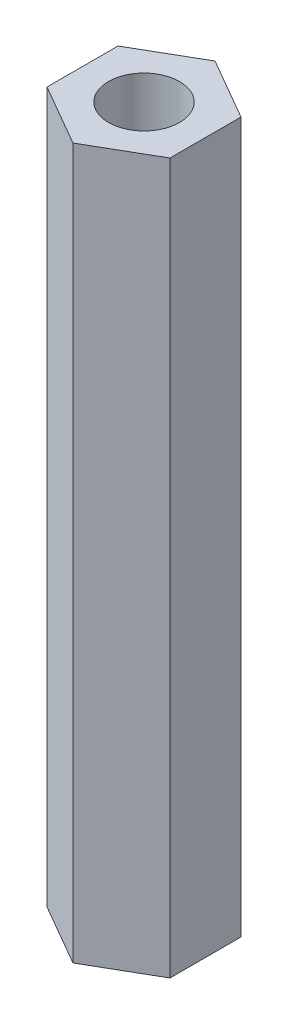
ISO-10303-21;
HEADER;
FILE_DESCRIPTION(('STEP AP214'),'2;1');
FILE_NAME('part.step','',(''),(''),'','','');
FILE_SCHEMA(('AUTOMOTIVE_DESIGN { 1 0 10303 214 1 1 1 1 }'));
ENDSEC;
DATA;
#1=APPLICATION_CONTEXT('core data for automotive mechanical design processes');
#2=APPLICATION_PROTOCOL_DEFINITION('international standard','automotive_design',2000,#1);
#3=PRODUCT_CONTEXT('',#1,'mechanical');
#4=PRODUCT('Part','Part','',(#3));
#5=PRODUCT_RELATED_PRODUCT_CATEGORY('part','',(#4));
#6=PRODUCT_DEFINITION_FORMATION('','',#4);
#7=PRODUCT_DEFINITION_CONTEXT('part definition',#1,'design');
#8=PRODUCT_DEFINITION('design','',#6,#7);
#9=PRODUCT_DEFINITION_SHAPE('','',#8);
#10=(LENGTH_UNIT() NAMED_UNIT(*) SI_UNIT(.MILLI.,.METRE.));
#11=(NAMED_UNIT(*) PLANE_ANGLE_UNIT() SI_UNIT($,.RADIAN.));
#12=(NAMED_UNIT(*) SI_UNIT($,.STERADIAN.) SOLID_ANGLE_UNIT());
#13=UNCERTAINTY_MEASURE_WITH_UNIT(LENGTH_MEASURE(1.E-05),#10,'distance_accuracy_value','');
#14=(GEOMETRIC_REPRESENTATION_CONTEXT(3) GLOBAL_UNCERTAINTY_ASSIGNED_CONTEXT((#13)) GLOBAL_UNIT_ASSIGNED_CONTEXT((#10,
#11,#12)) REPRESENTATION_CONTEXT('',''));
#15=CARTESIAN_POINT('',(0.,0.,0.));
#16=DIRECTION('',(0.,0.,1.));
#17=DIRECTION('',(1.,0.,0.));
#18=AXIS2_PLACEMENT_3D('',#15,#16,#17);
#19=CARTESIAN_POINT('',(-1.29903810567666,30.,2.25));
#20=DIRECTION('',(0.5,0.,-0.866025403784439));
#21=DIRECTION('',(-0.866025403784439,0.,-0.5));
#22=AXIS2_PLACEMENT_3D('',#19,#20,#21);
#23=PLANE('',#22);
#24=DIRECTION('',(0.866025403784439,0.,0.5));
#25=VECTOR('',#24,1.);
#26=CARTESIAN_POINT('',(-1.29903810567666,0.,2.25));
#27=LINE('',#26,#25);
#28=CARTESIAN_POINT('',(-2.59807621135332,0.,1.5));
#29=VERTEX_POINT('',#28);
#30=CARTESIAN_POINT('',(0.,0.,3.));
#31=VERTEX_POINT('',#30);
#32=EDGE_CURVE('E131',#29,#31,#27,.T.);
#33=ORIENTED_EDGE('',*,*,#32,.T.);
#34=DIRECTION('',(0.,-1.,0.));
#35=VECTOR('',#34,1.);
#36=CARTESIAN_POINT('',(0.,30.,3.));
#37=LINE('',#36,#35);
#38=CARTESIAN_POINT('',(0.,30.,3.));
#39=VERTEX_POINT('',#38);
#40=EDGE_CURVE('E11',#39,#31,#37,.T.);
#41=ORIENTED_EDGE('',*,*,#40,.F.);
#42=DIRECTION('',(0.866025403784439,0.,0.5));
#43=VECTOR('',#42,1.);
#44=CARTESIAN_POINT('',(-1.29903810567666,30.,2.25));
#45=LINE('',#44,#43);
#46=CARTESIAN_POINT('',(-2.59807621135332,30.,1.5));
#47=VERTEX_POINT('',#46);
#48=EDGE_CURVE('E167',#47,#39,#45,.T.);
#49=ORIENTED_EDGE('',*,*,#48,.F.);
#50=DIRECTION('',(0.,-1.,0.));
#51=VECTOR('',#50,1.);
#52=CARTESIAN_POINT('',(-2.59807621135332,30.,1.5));
#53=LINE('',#52,#51);
#54=EDGE_CURVE('E123',#47,#29,#53,.T.);
#55=ORIENTED_EDGE('',*,*,#54,.T.);
#56=EDGE_LOOP('',(#33,#41,#49,#55));
#57=FACE_BOUND('',#56,.T.);
#58=ADVANCED_FACE('F39',(#57),#23,.F.);
#59=CARTESIAN_POINT('',(1.29903810567666,30.,2.25));
#60=DIRECTION('',(-0.5,0.,-0.866025403784439));
#61=DIRECTION('',(-0.866025403784439,0.,0.5));
#62=AXIS2_PLACEMENT_3D('',#59,#60,#61);
#63=PLANE('',#62);
#64=DIRECTION('',(0.866025403784439,0.,-0.5));
#65=VECTOR('',#64,1.);
#66=CARTESIAN_POINT('',(1.29903810567666,0.,2.25));
#67=LINE('',#66,#65);
#68=CARTESIAN_POINT('',(2.59807621135332,0.,1.5));
#69=VERTEX_POINT('',#68);
#70=EDGE_CURVE('E135',#31,#69,#67,.T.);
#71=ORIENTED_EDGE('',*,*,#70,.T.);
#72=DIRECTION('',(0.,-1.,0.));
#73=VECTOR('',#72,1.);
#74=CARTESIAN_POINT('',(2.59807621135332,30.,1.5));
#75=LINE('',#74,#73);
#76=CARTESIAN_POINT('',(2.59807621135332,30.,1.5));
#77=VERTEX_POINT('',#76);
#78=EDGE_CURVE('E49',#77,#69,#75,.T.);
#79=ORIENTED_EDGE('',*,*,#78,.F.);
#80=DIRECTION('',(0.866025403784439,0.,-0.5));
#81=VECTOR('',#80,1.);
#82=CARTESIAN_POINT('',(1.29903810567666,30.,2.25));
#83=LINE('',#82,#81);
#84=EDGE_CURVE('E90',#39,#77,#83,.T.);
#85=ORIENTED_EDGE('',*,*,#84,.F.);
#86=ORIENTED_EDGE('',*,*,#40,.T.);
#87=EDGE_LOOP('',(#71,#79,#85,#86));
#88=FACE_BOUND('',#87,.T.);
#89=ADVANCED_FACE('F160',(#88),#63,.F.);
#90=CARTESIAN_POINT('',(2.59807621135332,30.,0.));
#91=DIRECTION('',(1.,0.,0.));
#92=DIRECTION('',(0.,0.,-1.));
#93=AXIS2_PLACEMENT_3D('',#90,#91,#92);
#94=PLANE('',#93);
#95=DIRECTION('',(0.,0.,1.));
#96=VECTOR('',#95,1.);
#97=CARTESIAN_POINT('',(2.59807621135332,0.,0.));
#98=LINE('',#97,#96);
#99=CARTESIAN_POINT('',(2.59807621135332,0.,-1.5));
#100=VERTEX_POINT('',#99);
#101=EDGE_CURVE('E139',#100,#69,#98,.T.);
#102=ORIENTED_EDGE('',*,*,#101,.F.);
#103=DIRECTION('',(0.,-1.,0.));
#104=VECTOR('',#103,1.);
#105=CARTESIAN_POINT('',(2.59807621135332,30.,-1.5));
#106=LINE('',#105,#104);
#107=CARTESIAN_POINT('',(2.59807621135332,30.,-1.5));
#108=VERTEX_POINT('',#107);
#109=EDGE_CURVE('E117',#108,#100,#106,.T.);
#110=ORIENTED_EDGE('',*,*,#109,.F.);
#111=DIRECTION('',(0.,0.,1.));
#112=VECTOR('',#111,1.);
#113=CARTESIAN_POINT('',(2.59807621135332,30.,0.));
#114=LINE('',#113,#112);
#115=EDGE_CURVE('E104',#108,#77,#114,.T.);
#116=ORIENTED_EDGE('',*,*,#115,.T.);
#117=ORIENTED_EDGE('',*,*,#78,.T.);
#118=EDGE_LOOP('',(#102,#110,#116,#117));
#119=FACE_BOUND('',#118,.T.);
#120=ADVANCED_FACE('F159',(#119),#94,.T.);
#121=CARTESIAN_POINT('',(1.29903810567666,30.,-2.25));
#122=DIRECTION('',(-0.5,0.,0.866025403784439));
#123=DIRECTION('',(0.866025403784439,0.,0.5));
#124=AXIS2_PLACEMENT_3D('',#121,#122,#123);
#125=PLANE('',#124);
#126=DIRECTION('',(-0.866025403784439,0.,-0.5));
#127=VECTOR('',#126,1.);
#128=CARTESIAN_POINT('',(1.29903810567666,0.,-2.25));
#129=LINE('',#128,#127);
#130=CARTESIAN_POINT('',(0.,0.,-3.));
#131=VERTEX_POINT('',#130);
#132=EDGE_CURVE('E112',#100,#131,#129,.T.);
#133=ORIENTED_EDGE('',*,*,#132,.T.);
#134=DIRECTION('',(0.,-1.,0.));
#135=VECTOR('',#134,1.);
#136=CARTESIAN_POINT('',(0.,30.,-3.));
#137=LINE('',#136,#135);
#138=CARTESIAN_POINT('',(0.,30.,-3.));
#139=VERTEX_POINT('',#138);
#140=EDGE_CURVE('E109',#139,#131,#137,.T.);
#141=ORIENTED_EDGE('',*,*,#140,.F.);
#142=DIRECTION('',(-0.866025403784439,0.,-0.5));
#143=VECTOR('',#142,1.);
#144=CARTESIAN_POINT('',(1.29903810567666,30.,-2.25));
#145=LINE('',#144,#143);
#146=EDGE_CURVE('E98',#108,#139,#145,.T.);
#147=ORIENTED_EDGE('',*,*,#146,.F.);
#148=ORIENTED_EDGE('',*,*,#109,.T.);
#149=EDGE_LOOP('',(#133,#141,#147,#148));
#150=FACE_BOUND('',#149,.T.);
#151=ADVANCED_FACE('F110',(#150),#125,.F.);
#152=CARTESIAN_POINT('',(-1.29903810567666,30.,-2.25));
#153=DIRECTION('',(-0.5,0.,-0.866025403784439));
#154=DIRECTION('',(-0.866025403784439,0.,0.5));
#155=AXIS2_PLACEMENT_3D('',#152,#153,#154);
#156=PLANE('',#155);
#157=DIRECTION('',(0.866025403784439,0.,-0.5));
#158=VECTOR('',#157,1.);
#159=CARTESIAN_POINT('',(-1.29903810567666,0.,-2.25));
#160=LINE('',#159,#158);
#161=CARTESIAN_POINT('',(-2.59807621135332,0.,-1.5));
#162=VERTEX_POINT('',#161);
#163=EDGE_CURVE('E145',#162,#131,#160,.T.);
#164=ORIENTED_EDGE('',*,*,#163,.F.);
#165=DIRECTION('',(0.,-1.,0.));
#166=VECTOR('',#165,1.);
#167=CARTESIAN_POINT('',(-2.59807621135332,30.,-1.5));
#168=LINE('',#167,#166);
#169=CARTESIAN_POINT('',(-2.59807621135332,30.,-1.5));
#170=VERTEX_POINT('',#169);
#171=EDGE_CURVE('E79',#170,#162,#168,.T.);
#172=ORIENTED_EDGE('',*,*,#171,.F.);
#173=DIRECTION('',(0.866025403784439,0.,-0.5));
#174=VECTOR('',#173,1.);
#175=CARTESIAN_POINT('',(-1.29903810567666,30.,-2.25));
#176=LINE('',#175,#174);
#177=EDGE_CURVE('E102',#170,#139,#176,.T.);
#178=ORIENTED_EDGE('',*,*,#177,.T.);
#179=ORIENTED_EDGE('',*,*,#140,.T.);
#180=EDGE_LOOP('',(#164,#172,#178,#179));
#181=FACE_BOUND('',#180,.T.);
#182=ADVANCED_FACE('F119',(#181),#156,.T.);
#183=CARTESIAN_POINT('',(0.,30.,0.));
#184=DIRECTION('',(0.,-1.,0.));
#185=DIRECTION('',(0.,0.,-1.));
#186=AXIS2_PLACEMENT_3D('',#183,#184,#185);
#187=CYLINDRICAL_SURFACE('',#186,1.5);
#188=CARTESIAN_POINT('',(0.,30.,0.));
#189=DIRECTION('',(0.,1.,0.));
#190=DIRECTION('',(0.,0.,1.));
#191=AXIS2_PLACEMENT_3D('',#188,#189,#190);
#192=CIRCLE('',#191,1.5);
#193=CARTESIAN_POINT('',(0.,30.,1.5));
#194=VERTEX_POINT('',#193);
#195=EDGE_CURVE('E150',#194,#194,#192,.T.);
#196=ORIENTED_EDGE('',*,*,#195,.T.);
#197=EDGE_LOOP('',(#196));
#198=FACE_BOUND('',#197,.T.);
#199=CARTESIAN_POINT('',(0.,0.,0.));
#200=DIRECTION('',(0.,1.,0.));
#201=DIRECTION('',(0.,0.,1.));
#202=AXIS2_PLACEMENT_3D('',#199,#200,#201);
#203=CIRCLE('',#202,1.5);
#204=CARTESIAN_POINT('',(0.,0.,1.5));
#205=VERTEX_POINT('',#204);
#206=EDGE_CURVE('E127',#205,#205,#203,.T.);
#207=ORIENTED_EDGE('',*,*,#206,.F.);
#208=EDGE_LOOP('',(#207));
#209=FACE_BOUND('',#208,.T.);
#210=ADVANCED_FACE('F41',(#198,#209),#187,.F.);
#211=CARTESIAN_POINT('',(-2.59807621135332,30.,0.));
#212=DIRECTION('',(1.,0.,0.));
#213=DIRECTION('',(0.,0.,-1.));
#214=AXIS2_PLACEMENT_3D('',#211,#212,#213);
#215=PLANE('',#214);
#216=DIRECTION('',(0.,0.,1.));
#217=VECTOR('',#216,1.);
#218=CARTESIAN_POINT('',(-2.59807621135332,0.,0.));
#219=LINE('',#218,#217);
#220=EDGE_CURVE('E82',#162,#29,#219,.T.);
#221=ORIENTED_EDGE('',*,*,#220,.T.);
#222=ORIENTED_EDGE('',*,*,#54,.F.);
#223=DIRECTION('',(0.,0.,1.));
#224=VECTOR('',#223,1.);
#225=CARTESIAN_POINT('',(-2.59807621135332,30.,0.));
#226=LINE('',#225,#224);
#227=EDGE_CURVE('E57',#170,#47,#226,.T.);
#228=ORIENTED_EDGE('',*,*,#227,.F.);
#229=ORIENTED_EDGE('',*,*,#171,.T.);
#230=EDGE_LOOP('',(#221,#222,#228,#229));
#231=FACE_BOUND('',#230,.T.);
#232=ADVANCED_FACE('F168',(#231),#215,.F.);
#233=CARTESIAN_POINT('',(0.,30.,0.));
#234=DIRECTION('',(0.,1.,0.));
#235=DIRECTION('',(0.,0.,1.));
#236=AXIS2_PLACEMENT_3D('',#233,#234,#235);
#237=PLANE('',#236);
#238=ORIENTED_EDGE('',*,*,#195,.F.);
#239=EDGE_LOOP('',(#238));
#240=FACE_BOUND('',#239,.T.);
#241=ORIENTED_EDGE('',*,*,#48,.T.);
#242=ORIENTED_EDGE('',*,*,#84,.T.);
#243=ORIENTED_EDGE('',*,*,#115,.F.);
#244=ORIENTED_EDGE('',*,*,#146,.T.);
#245=ORIENTED_EDGE('',*,*,#177,.F.);
#246=ORIENTED_EDGE('',*,*,#227,.T.);
#247=EDGE_LOOP('',(#241,#242,#243,#244,#245,#246));
#248=FACE_BOUND('',#247,.T.);
#249=ADVANCED_FACE('F100',(#240,#248),#237,.T.);
#250=CARTESIAN_POINT('',(0.,0.,0.));
#251=DIRECTION('',(0.,1.,0.));
#252=DIRECTION('',(0.,0.,1.));
#253=AXIS2_PLACEMENT_3D('',#250,#251,#252);
#254=PLANE('',#253);
#255=ORIENTED_EDGE('',*,*,#206,.T.);
#256=EDGE_LOOP('',(#255));
#257=FACE_BOUND('',#256,.T.);
#258=ORIENTED_EDGE('',*,*,#32,.F.);
#259=ORIENTED_EDGE('',*,*,#220,.F.);
#260=ORIENTED_EDGE('',*,*,#163,.T.);
#261=ORIENTED_EDGE('',*,*,#132,.F.);
#262=ORIENTED_EDGE('',*,*,#101,.T.);
#263=ORIENTED_EDGE('',*,*,#70,.F.);
#264=EDGE_LOOP('',(#258,#259,#260,#261,#262,#263));
#265=FACE_BOUND('',#264,.T.);
#266=ADVANCED_FACE('F164',(#257,#265),#254,.F.);
#267=CLOSED_SHELL('',(#58,#89,#120,#151,#182,#210,#232,#249,#266));
#268=MANIFOLD_SOLID_BREP('B2',#267);
#269=ADVANCED_BREP_SHAPE_REPRESENTATION('',(#18,#268),#14);
#270=SHAPE_DEFINITION_REPRESENTATION(#9,#269);
ENDSEC;
END-ISO-10303-21;
